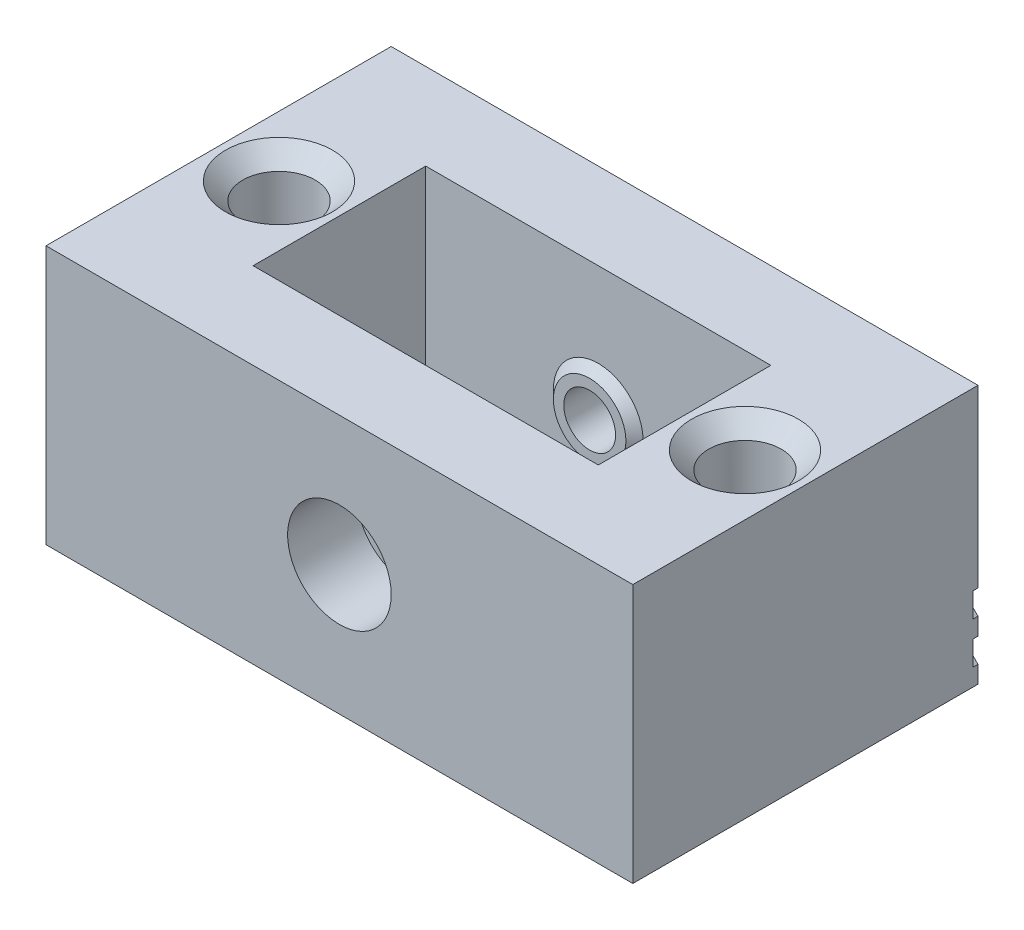
ISO-10303-21;
HEADER;
FILE_DESCRIPTION(('STEP AP214'),'2;1');
FILE_NAME('part.step','',(''),(''),'','','');
FILE_SCHEMA(('AUTOMOTIVE_DESIGN { 1 0 10303 214 1 1 1 1 }'));
ENDSEC;
DATA;
#1=APPLICATION_CONTEXT('core data for automotive mechanical design processes');
#2=APPLICATION_PROTOCOL_DEFINITION('international standard','automotive_design',2000,#1);
#3=PRODUCT_CONTEXT('',#1,'mechanical');
#4=PRODUCT('Part','Part','',(#3));
#5=PRODUCT_RELATED_PRODUCT_CATEGORY('part','',(#4));
#6=PRODUCT_DEFINITION_FORMATION('','',#4);
#7=PRODUCT_DEFINITION_CONTEXT('part definition',#1,'design');
#8=PRODUCT_DEFINITION('design','',#6,#7);
#9=PRODUCT_DEFINITION_SHAPE('','',#8);
#10=(LENGTH_UNIT() NAMED_UNIT(*) SI_UNIT(.MILLI.,.METRE.));
#11=(NAMED_UNIT(*) PLANE_ANGLE_UNIT() SI_UNIT($,.RADIAN.));
#12=(NAMED_UNIT(*) SI_UNIT($,.STERADIAN.) SOLID_ANGLE_UNIT());
#13=UNCERTAINTY_MEASURE_WITH_UNIT(LENGTH_MEASURE(1.E-05),#10,'distance_accuracy_value','');
#14=(GEOMETRIC_REPRESENTATION_CONTEXT(3) GLOBAL_UNCERTAINTY_ASSIGNED_CONTEXT((#13)) GLOBAL_UNIT_ASSIGNED_CONTEXT((#10,
#11,#12)) REPRESENTATION_CONTEXT('',''));
#15=CARTESIAN_POINT('',(0.,0.,0.));
#16=DIRECTION('',(0.,0.,1.));
#17=DIRECTION('',(1.,0.,0.));
#18=AXIS2_PLACEMENT_3D('',#15,#16,#17);
#19=CARTESIAN_POINT('',(-10.,-5.,5.));
#20=DIRECTION('',(0.,0.,1.));
#21=DIRECTION('',(1.,0.,0.));
#22=AXIS2_PLACEMENT_3D('',#19,#20,#21);
#23=PLANE('',#22);
#24=CARTESIAN_POINT('',(0.,7.5,5.));
#25=DIRECTION('',(0.,0.,1.));
#26=DIRECTION('',(1.,0.,0.));
#27=AXIS2_PLACEMENT_3D('',#24,#25,#26);
#28=CIRCLE('',#27,2.6);
#29=CARTESIAN_POINT('',(2.6,7.5,5.));
#30=VERTEX_POINT('',#29);
#31=EDGE_CURVE('E355',#30,#30,#28,.T.);
#32=ORIENTED_EDGE('',*,*,#31,.T.);
#33=EDGE_LOOP('',(#32));
#34=FACE_BOUND('',#33,.T.);
#35=DIRECTION('',(-1.,0.,0.));
#36=VECTOR('',#35,1.);
#37=CARTESIAN_POINT('',(0.,0.,5.));
#38=LINE('',#37,#36);
#39=CARTESIAN_POINT('',(10.,0.,5.));
#40=VERTEX_POINT('',#39);
#41=CARTESIAN_POINT('',(-10.,0.,5.));
#42=VERTEX_POINT('',#41);
#43=EDGE_CURVE('E345',#40,#42,#38,.T.);
#44=ORIENTED_EDGE('',*,*,#43,.T.);
#45=DIRECTION('',(0.,1.,0.));
#46=VECTOR('',#45,1.);
#47=CARTESIAN_POINT('',(-10.,-5.,5.));
#48=LINE('',#47,#46);
#49=CARTESIAN_POINT('',(-10.,15.,5.));
#50=VERTEX_POINT('',#49);
#51=EDGE_CURVE('E304',#42,#50,#48,.T.);
#52=ORIENTED_EDGE('',*,*,#51,.T.);
#53=DIRECTION('',(1.,0.,0.));
#54=VECTOR('',#53,1.);
#55=CARTESIAN_POINT('',(-10.,15.,5.));
#56=LINE('',#55,#54);
#57=CARTESIAN_POINT('',(10.,15.,5.));
#58=VERTEX_POINT('',#57);
#59=EDGE_CURVE('E295',#50,#58,#56,.T.);
#60=ORIENTED_EDGE('',*,*,#59,.T.);
#61=DIRECTION('',(0.,1.,0.));
#62=VECTOR('',#61,1.);
#63=CARTESIAN_POINT('',(10.,-5.,5.));
#64=LINE('',#63,#62);
#65=EDGE_CURVE('E310',#40,#58,#64,.T.);
#66=ORIENTED_EDGE('',*,*,#65,.F.);
#67=EDGE_LOOP('',(#44,#52,#60,#66));
#68=FACE_BOUND('',#67,.T.);
#69=ADVANCED_FACE('F37',(#34,#68),#23,.F.);
#70=CARTESIAN_POINT('',(-10.,-5.,-5.));
#71=DIRECTION('',(0.,0.,-1.));
#72=DIRECTION('',(-1.,0.,0.));
#73=AXIS2_PLACEMENT_3D('',#70,#71,#72);
#74=PLANE('',#73);
#75=CARTESIAN_POINT('',(0.,7.5,-5.));
#76=DIRECTION('',(0.,0.,-1.));
#77=DIRECTION('',(-1.,0.,0.));
#78=AXIS2_PLACEMENT_3D('',#75,#76,#77);
#79=CIRCLE('',#78,2.60000000000001);
#80=CARTESIAN_POINT('',(-2.60000000000001,7.5,-5.));
#81=VERTEX_POINT('',#80);
#82=EDGE_CURVE('E360',#81,#81,#79,.T.);
#83=ORIENTED_EDGE('',*,*,#82,.T.);
#84=EDGE_LOOP('',(#83));
#85=FACE_BOUND('',#84,.T.);
#86=DIRECTION('',(1.,0.,0.));
#87=VECTOR('',#86,1.);
#88=CARTESIAN_POINT('',(0.,0.,-5.));
#89=LINE('',#88,#87);
#90=CARTESIAN_POINT('',(-10.,0.,-5.));
#91=VERTEX_POINT('',#90);
#92=CARTESIAN_POINT('',(10.,0.,-5.));
#93=VERTEX_POINT('',#92);
#94=EDGE_CURVE('E351',#91,#93,#89,.T.);
#95=ORIENTED_EDGE('',*,*,#94,.T.);
#96=DIRECTION('',(0.,1.,0.));
#97=VECTOR('',#96,1.);
#98=CARTESIAN_POINT('',(10.,-5.,-5.));
#99=LINE('',#98,#97);
#100=CARTESIAN_POINT('',(10.,15.,-5.));
#101=VERTEX_POINT('',#100);
#102=EDGE_CURVE('E308',#93,#101,#99,.T.);
#103=ORIENTED_EDGE('',*,*,#102,.T.);
#104=DIRECTION('',(-1.,0.,0.));
#105=VECTOR('',#104,1.);
#106=CARTESIAN_POINT('',(-10.,15.,-5.));
#107=LINE('',#106,#105);
#108=CARTESIAN_POINT('',(-10.,15.,-5.));
#109=VERTEX_POINT('',#108);
#110=EDGE_CURVE('E301',#101,#109,#107,.T.);
#111=ORIENTED_EDGE('',*,*,#110,.T.);
#112=DIRECTION('',(0.,1.,0.));
#113=VECTOR('',#112,1.);
#114=CARTESIAN_POINT('',(-10.,-5.,-5.));
#115=LINE('',#114,#113);
#116=EDGE_CURVE('E305',#91,#109,#115,.T.);
#117=ORIENTED_EDGE('',*,*,#116,.F.);
#118=EDGE_LOOP('',(#95,#103,#111,#117));
#119=FACE_BOUND('',#118,.T.);
#120=ADVANCED_FACE('F441',(#85,#119),#74,.F.);
#121=CARTESIAN_POINT('',(0.,7.5,10.));
#122=DIRECTION('',(0.,0.,-1.));
#123=DIRECTION('',(-1.,0.,0.));
#124=AXIS2_PLACEMENT_3D('',#121,#122,#123);
#125=CYLINDRICAL_SURFACE('',#124,1.5);
#126=CARTESIAN_POINT('',(0.,7.5,6.));
#127=DIRECTION('',(0.,0.,1.));
#128=DIRECTION('',(1.,0.,0.));
#129=AXIS2_PLACEMENT_3D('',#126,#127,#128);
#130=CIRCLE('',#129,1.5);
#131=CARTESIAN_POINT('',(1.5,7.5,6.));
#132=VERTEX_POINT('',#131);
#133=EDGE_CURVE('E287',#132,#132,#130,.F.);
#134=ORIENTED_EDGE('',*,*,#133,.F.);
#135=EDGE_LOOP('',(#134));
#136=FACE_BOUND('',#135,.T.);
#137=CARTESIAN_POINT('',(0.,7.5,4.5));
#138=DIRECTION('',(0.,0.,-1.));
#139=DIRECTION('',(-1.,0.,0.));
#140=AXIS2_PLACEMENT_3D('',#137,#138,#139);
#141=CIRCLE('',#140,1.5);
#142=CARTESIAN_POINT('',(-1.5,7.5,4.5));
#143=VERTEX_POINT('',#142);
#144=EDGE_CURVE('E269',#143,#143,#141,.T.);
#145=ORIENTED_EDGE('',*,*,#144,.T.);
#146=EDGE_LOOP('',(#145));
#147=FACE_BOUND('',#146,.T.);
#148=ADVANCED_FACE('F447',(#136,#147),#125,.F.);
#149=CARTESIAN_POINT('',(17.,15.,10.));
#150=DIRECTION('',(-1.,0.,0.));
#151=DIRECTION('',(0.,0.,1.));
#152=AXIS2_PLACEMENT_3D('',#149,#150,#151);
#153=PLANE('',#152);
#154=DIRECTION('',(0.,-1.,0.));
#155=VECTOR('',#154,1.);
#156=CARTESIAN_POINT('',(17.,3.41421356237307,-9.7));
#157=LINE('',#156,#155);
#158=CARTESIAN_POINT('',(17.,4.82842712474617,-9.7));
#159=VERTEX_POINT('',#158);
#160=CARTESIAN_POINT('',(17.,3.41421356237307,-9.7));
#161=VERTEX_POINT('',#160);
#162=EDGE_CURVE('E230',#159,#161,#157,.T.);
#163=ORIENTED_EDGE('',*,*,#162,.F.);
#164=DIRECTION('',(0.,0.,-1.));
#165=VECTOR('',#164,1.);
#166=CARTESIAN_POINT('',(17.,4.82842712474617,-9.7));
#167=LINE('',#166,#165);
#168=CARTESIAN_POINT('',(17.,4.82842712474617,-10.));
#169=VERTEX_POINT('',#168);
#170=EDGE_CURVE('E221',#159,#169,#167,.T.);
#171=ORIENTED_EDGE('',*,*,#170,.T.);
#172=DIRECTION('',(0.,-1.,0.));
#173=VECTOR('',#172,1.);
#174=CARTESIAN_POINT('',(17.,15.,-10.));
#175=LINE('',#174,#173);
#176=CARTESIAN_POINT('',(17.,15.,-10.));
#177=VERTEX_POINT('',#176);
#178=EDGE_CURVE('E342',#177,#169,#175,.T.);
#179=ORIENTED_EDGE('',*,*,#178,.F.);
#180=DIRECTION('',(0.,0.,-1.));
#181=VECTOR('',#180,1.);
#182=CARTESIAN_POINT('',(17.,15.,10.));
#183=LINE('',#182,#181);
#184=CARTESIAN_POINT('',(17.,15.,10.));
#185=VERTEX_POINT('',#184);
#186=EDGE_CURVE('E314',#185,#177,#183,.T.);
#187=ORIENTED_EDGE('',*,*,#186,.F.);
#188=DIRECTION('',(0.,-1.,0.));
#189=VECTOR('',#188,1.);
#190=CARTESIAN_POINT('',(17.,15.,10.));
#191=LINE('',#190,#189);
#192=CARTESIAN_POINT('',(17.,0.,10.));
#193=VERTEX_POINT('',#192);
#194=EDGE_CURVE('E324',#185,#193,#191,.T.);
#195=ORIENTED_EDGE('',*,*,#194,.T.);
#196=DIRECTION('',(0.,0.,-1.));
#197=VECTOR('',#196,1.);
#198=CARTESIAN_POINT('',(17.,0.,10.));
#199=LINE('',#198,#197);
#200=CARTESIAN_POINT('',(17.,0.,-10.));
#201=VERTEX_POINT('',#200);
#202=EDGE_CURVE('E307',#193,#201,#199,.T.);
#203=ORIENTED_EDGE('',*,*,#202,.T.);
#204=CARTESIAN_POINT('',(17.,0.999999999999997,-10.));
#205=VERTEX_POINT('',#204);
#206=EDGE_CURVE('E340',#205,#201,#175,.T.);
#207=ORIENTED_EDGE('',*,*,#206,.F.);
#208=DIRECTION('',(0.,0.,-1.));
#209=VECTOR('',#208,1.);
#210=CARTESIAN_POINT('',(17.,1.,-9.7));
#211=LINE('',#210,#209);
#212=CARTESIAN_POINT('',(17.,1.,-9.7));
#213=VERTEX_POINT('',#212);
#214=EDGE_CURVE('E53',#213,#205,#211,.T.);
#215=ORIENTED_EDGE('',*,*,#214,.F.);
#216=DIRECTION('',(0.,-1.,0.));
#217=VECTOR('',#216,1.);
#218=CARTESIAN_POINT('',(17.,1.,-9.7));
#219=LINE('',#218,#217);
#220=CARTESIAN_POINT('',(17.,2.41421356237307,-9.7));
#221=VERTEX_POINT('',#220);
#222=EDGE_CURVE('E247',#221,#213,#219,.T.);
#223=ORIENTED_EDGE('',*,*,#222,.F.);
#224=DIRECTION('',(0.,0.,-1.));
#225=VECTOR('',#224,1.);
#226=CARTESIAN_POINT('',(17.,2.41421356237307,-9.7));
#227=LINE('',#226,#225);
#228=CARTESIAN_POINT('',(17.,2.41421356237307,-10.));
#229=VERTEX_POINT('',#228);
#230=EDGE_CURVE('E259',#221,#229,#227,.T.);
#231=ORIENTED_EDGE('',*,*,#230,.T.);
#232=CARTESIAN_POINT('',(17.,3.41421356237307,-10.));
#233=VERTEX_POINT('',#232);
#234=EDGE_CURVE('E346',#233,#229,#175,.T.);
#235=ORIENTED_EDGE('',*,*,#234,.F.);
#236=DIRECTION('',(0.,0.,-1.));
#237=VECTOR('',#236,1.);
#238=CARTESIAN_POINT('',(17.,3.41421356237307,-9.7));
#239=LINE('',#238,#237);
#240=EDGE_CURVE('E61',#161,#233,#239,.T.);
#241=ORIENTED_EDGE('',*,*,#240,.F.);
#242=EDGE_LOOP('',(#163,#171,#179,#187,#195,#203,#207,#215,#223,#231,#235,#241));
#243=FACE_BOUND('',#242,.T.);
#244=ADVANCED_FACE('F404',(#243),#153,.F.);
#245=CARTESIAN_POINT('',(-17.,15.,-10.));
#246=DIRECTION('',(0.,0.,1.));
#247=DIRECTION('',(1.,0.,0.));
#248=AXIS2_PLACEMENT_3D('',#245,#246,#247);
#249=PLANE('',#248);
#250=CARTESIAN_POINT('',(0.,7.5,-10.));
#251=DIRECTION('',(0.,0.,-1.));
#252=DIRECTION('',(-1.,0.,0.));
#253=AXIS2_PLACEMENT_3D('',#250,#251,#252);
#254=CIRCLE('',#253,1.5);
#255=CARTESIAN_POINT('',(-1.5,7.5,-10.));
#256=VERTEX_POINT('',#255);
#257=EDGE_CURVE('E290',#256,#256,#254,.T.);
#258=ORIENTED_EDGE('',*,*,#257,.F.);
#259=EDGE_LOOP('',(#258));
#260=FACE_BOUND('',#259,.T.);
#261=DIRECTION('',(-0.707106781186538,-0.707106781186557,0.));
#262=VECTOR('',#261,1.);
#263=CARTESIAN_POINT('',(-16.2928932188135,1.70710678118656,-10.));
#264=LINE('',#263,#262);
#265=CARTESIAN_POINT('',(-16.2928932188135,1.70710678118656,-10.));
#266=VERTEX_POINT('',#265);
#267=CARTESIAN_POINT('',(-17.,1.,-10.));
#268=VERTEX_POINT('',#267);
#269=EDGE_CURVE('E212',#266,#268,#264,.T.);
#270=ORIENTED_EDGE('',*,*,#269,.F.);
#271=DIRECTION('',(0.707106781186556,-0.707106781186539,0.));
#272=VECTOR('',#271,1.);
#273=CARTESIAN_POINT('',(-17.,2.41421356237308,-10.));
#274=LINE('',#273,#272);
#275=CARTESIAN_POINT('',(-17.,2.41421356237308,-10.));
#276=VERTEX_POINT('',#275);
#277=EDGE_CURVE('E218',#276,#266,#274,.T.);
#278=ORIENTED_EDGE('',*,*,#277,.F.);
#279=DIRECTION('',(0.,-1.,0.));
#280=VECTOR('',#279,1.);
#281=CARTESIAN_POINT('',(-17.,15.,-10.));
#282=LINE('',#281,#280);
#283=CARTESIAN_POINT('',(-17.,3.41421356237307,-10.));
#284=VERTEX_POINT('',#283);
#285=EDGE_CURVE('E341',#284,#276,#282,.T.);
#286=ORIENTED_EDGE('',*,*,#285,.F.);
#287=DIRECTION('',(-0.707106781186542,-0.707106781186553,0.));
#288=VECTOR('',#287,1.);
#289=CARTESIAN_POINT('',(-16.2928932188135,4.12132034355963,-10.));
#290=LINE('',#289,#288);
#291=CARTESIAN_POINT('',(-16.2928932188135,4.12132034355963,-10.));
#292=VERTEX_POINT('',#291);
#293=EDGE_CURVE('E733',#292,#284,#290,.T.);
#294=ORIENTED_EDGE('',*,*,#293,.F.);
#295=DIRECTION('',(0.707106781186552,-0.707106781186543,0.));
#296=VECTOR('',#295,1.);
#297=CARTESIAN_POINT('',(-17.,4.82842712474617,-10.));
#298=LINE('',#297,#296);
#299=CARTESIAN_POINT('',(-17.,4.82842712474617,-10.));
#300=VERTEX_POINT('',#299);
#301=EDGE_CURVE('E731',#300,#292,#298,.T.);
#302=ORIENTED_EDGE('',*,*,#301,.F.);
#303=CARTESIAN_POINT('',(-17.,15.,-10.));
#304=VERTEX_POINT('',#303);
#305=EDGE_CURVE('E201',#304,#300,#282,.T.);
#306=ORIENTED_EDGE('',*,*,#305,.F.);
#307=DIRECTION('',(-1.,0.,0.));
#308=VECTOR('',#307,1.);
#309=CARTESIAN_POINT('',(-17.,15.,-10.));
#310=LINE('',#309,#308);
#311=EDGE_CURVE('E317',#177,#304,#310,.T.);
#312=ORIENTED_EDGE('',*,*,#311,.F.);
#313=ORIENTED_EDGE('',*,*,#178,.T.);
#314=DIRECTION('',(0.707106781186552,0.707106781186543,0.));
#315=VECTOR('',#314,1.);
#316=CARTESIAN_POINT('',(17.,4.82842712474617,-10.));
#317=LINE('',#316,#315);
#318=CARTESIAN_POINT('',(16.2928932188135,4.12132034355963,-10.));
#319=VERTEX_POINT('',#318);
#320=EDGE_CURVE('E234',#319,#169,#317,.T.);
#321=ORIENTED_EDGE('',*,*,#320,.F.);
#322=DIRECTION('',(-0.707106781186535,0.70710678118656,0.));
#323=VECTOR('',#322,1.);
#324=CARTESIAN_POINT('',(16.2928932188135,4.12132034355963,-10.));
#325=LINE('',#324,#323);
#326=EDGE_CURVE('E203',#233,#319,#325,.T.);
#327=ORIENTED_EDGE('',*,*,#326,.F.);
#328=ORIENTED_EDGE('',*,*,#234,.T.);
#329=DIRECTION('',(0.707106781186559,0.707106781186536,0.));
#330=VECTOR('',#329,1.);
#331=CARTESIAN_POINT('',(17.,2.41421356237307,-10.));
#332=LINE('',#331,#330);
#333=CARTESIAN_POINT('',(16.2928932188132,1.70710678118633,-10.));
#334=VERTEX_POINT('',#333);
#335=EDGE_CURVE('E251',#334,#229,#332,.T.);
#336=ORIENTED_EDGE('',*,*,#335,.F.);
#337=DIRECTION('',(-0.707106781186763,0.707106781186332,0.));
#338=VECTOR('',#337,1.);
#339=CARTESIAN_POINT('',(16.2928932188132,1.70710678118633,-10.));
#340=LINE('',#339,#338);
#341=EDGE_CURVE('E225',#205,#334,#340,.T.);
#342=ORIENTED_EDGE('',*,*,#341,.F.);
#343=ORIENTED_EDGE('',*,*,#206,.T.);
#344=DIRECTION('',(-1.,0.,0.));
#345=VECTOR('',#344,1.);
#346=CARTESIAN_POINT('',(-17.,0.,-10.));
#347=LINE('',#346,#345);
#348=CARTESIAN_POINT('',(-17.,0.,-10.));
#349=VERTEX_POINT('',#348);
#350=EDGE_CURVE('E327',#201,#349,#347,.T.);
#351=ORIENTED_EDGE('',*,*,#350,.T.);
#352=EDGE_CURVE('E338',#268,#349,#282,.T.);
#353=ORIENTED_EDGE('',*,*,#352,.F.);
#354=EDGE_LOOP('',(#270,#278,#286,#294,#302,#306,#312,#313,#321,#327,#328,#336,#342,#343,#351,#353));
#355=FACE_BOUND('',#354,.T.);
#356=ADVANCED_FACE('F417',(#260,#355),#249,.F.);
#357=CARTESIAN_POINT('',(-17.,15.,10.));
#358=DIRECTION('',(1.,0.,0.));
#359=DIRECTION('',(0.,0.,-1.));
#360=AXIS2_PLACEMENT_3D('',#357,#358,#359);
#361=PLANE('',#360);
#362=ORIENTED_EDGE('',*,*,#285,.T.);
#363=DIRECTION('',(0.,0.,-1.));
#364=VECTOR('',#363,1.);
#365=CARTESIAN_POINT('',(-17.,2.41421356237308,-9.7));
#366=LINE('',#365,#364);
#367=CARTESIAN_POINT('',(-17.,2.41421356237308,-9.7));
#368=VERTEX_POINT('',#367);
#369=EDGE_CURVE('E223',#368,#276,#366,.T.);
#370=ORIENTED_EDGE('',*,*,#369,.F.);
#371=DIRECTION('',(0.,1.,0.));
#372=VECTOR('',#371,1.);
#373=CARTESIAN_POINT('',(-17.,1.,-9.7));
#374=LINE('',#373,#372);
#375=CARTESIAN_POINT('',(-17.,0.999999999999999,-9.7));
#376=VERTEX_POINT('',#375);
#377=EDGE_CURVE('E214',#376,#368,#374,.T.);
#378=ORIENTED_EDGE('',*,*,#377,.F.);
#379=DIRECTION('',(0.,0.,-1.));
#380=VECTOR('',#379,1.);
#381=CARTESIAN_POINT('',(-17.,1.,-9.7));
#382=LINE('',#381,#380);
#383=EDGE_CURVE('E226',#376,#268,#382,.T.);
#384=ORIENTED_EDGE('',*,*,#383,.T.);
#385=ORIENTED_EDGE('',*,*,#352,.T.);
#386=DIRECTION('',(0.,0.,1.));
#387=VECTOR('',#386,1.);
#388=CARTESIAN_POINT('',(-17.,0.,10.));
#389=LINE('',#388,#387);
#390=CARTESIAN_POINT('',(-17.,0.,10.));
#391=VERTEX_POINT('',#390);
#392=EDGE_CURVE('E330',#349,#391,#389,.T.);
#393=ORIENTED_EDGE('',*,*,#392,.T.);
#394=DIRECTION('',(0.,-1.,0.));
#395=VECTOR('',#394,1.);
#396=CARTESIAN_POINT('',(-17.,15.,10.));
#397=LINE('',#396,#395);
#398=CARTESIAN_POINT('',(-17.,15.,10.));
#399=VERTEX_POINT('',#398);
#400=EDGE_CURVE('E335',#399,#391,#397,.T.);
#401=ORIENTED_EDGE('',*,*,#400,.F.);
#402=DIRECTION('',(0.,0.,1.));
#403=VECTOR('',#402,1.);
#404=CARTESIAN_POINT('',(-17.,15.,10.));
#405=LINE('',#404,#403);
#406=EDGE_CURVE('E320',#304,#399,#405,.T.);
#407=ORIENTED_EDGE('',*,*,#406,.F.);
#408=ORIENTED_EDGE('',*,*,#305,.T.);
#409=DIRECTION('',(0.,0.,-1.));
#410=VECTOR('',#409,1.);
#411=CARTESIAN_POINT('',(-17.,4.82842712474617,-9.7));
#412=LINE('',#411,#410);
#413=CARTESIAN_POINT('',(-17.,4.82842712474617,-9.7));
#414=VERTEX_POINT('',#413);
#415=EDGE_CURVE('E191',#414,#300,#412,.T.);
#416=ORIENTED_EDGE('',*,*,#415,.F.);
#417=DIRECTION('',(0.,1.,0.));
#418=VECTOR('',#417,1.);
#419=CARTESIAN_POINT('',(-17.,3.41421356237307,-9.7));
#420=LINE('',#419,#418);
#421=CARTESIAN_POINT('',(-17.,3.41421356237307,-9.7));
#422=VERTEX_POINT('',#421);
#423=EDGE_CURVE('E177',#422,#414,#420,.T.);
#424=ORIENTED_EDGE('',*,*,#423,.F.);
#425=DIRECTION('',(0.,0.,-1.));
#426=VECTOR('',#425,1.);
#427=CARTESIAN_POINT('',(-17.,3.41421356237307,-9.7));
#428=LINE('',#427,#426);
#429=EDGE_CURVE('E194',#422,#284,#428,.T.);
#430=ORIENTED_EDGE('',*,*,#429,.T.);
#431=EDGE_LOOP('',(#362,#370,#378,#384,#385,#393,#401,#407,#408,#416,#424,#430));
#432=FACE_BOUND('',#431,.T.);
#433=ADVANCED_FACE('F198',(#432),#361,.F.);
#434=CARTESIAN_POINT('',(-17.,15.,10.));
#435=DIRECTION('',(0.,0.,-1.));
#436=DIRECTION('',(-1.,0.,0.));
#437=AXIS2_PLACEMENT_3D('',#434,#435,#436);
#438=PLANE('',#437);
#439=CARTESIAN_POINT('',(0.,7.5,10.));
#440=DIRECTION('',(0.,0.,1.));
#441=DIRECTION('',(1.,0.,0.));
#442=AXIS2_PLACEMENT_3D('',#439,#440,#441);
#443=CIRCLE('',#442,3.);
#444=CARTESIAN_POINT('',(3.,7.5,10.));
#445=VERTEX_POINT('',#444);
#446=EDGE_CURVE('E283',#445,#445,#443,.T.);
#447=ORIENTED_EDGE('',*,*,#446,.F.);
#448=EDGE_LOOP('',(#447));
#449=FACE_BOUND('',#448,.T.);
#450=DIRECTION('',(1.,0.,0.));
#451=VECTOR('',#450,1.);
#452=CARTESIAN_POINT('',(-17.,0.,10.));
#453=LINE('',#452,#451);
#454=EDGE_CURVE('E318',#391,#193,#453,.T.);
#455=ORIENTED_EDGE('',*,*,#454,.T.);
#456=ORIENTED_EDGE('',*,*,#194,.F.);
#457=DIRECTION('',(1.,0.,0.));
#458=VECTOR('',#457,1.);
#459=CARTESIAN_POINT('',(-17.,15.,10.));
#460=LINE('',#459,#458);
#461=EDGE_CURVE('E322',#399,#185,#460,.T.);
#462=ORIENTED_EDGE('',*,*,#461,.F.);
#463=ORIENTED_EDGE('',*,*,#400,.T.);
#464=EDGE_LOOP('',(#455,#456,#462,#463));
#465=FACE_BOUND('',#464,.T.);
#466=ADVANCED_FACE('F410',(#449,#465),#438,.F.);
#467=CARTESIAN_POINT('',(0.,15.,0.));
#468=DIRECTION('',(0.,-1.,0.));
#469=DIRECTION('',(0.,0.,-1.));
#470=AXIS2_PLACEMENT_3D('',#467,#468,#469);
#471=PLANE('',#470);
#472=CARTESIAN_POINT('',(13.5,15.,0.));
#473=DIRECTION('',(0.,-1.,0.));
#474=DIRECTION('',(0.,0.,-1.));
#475=AXIS2_PLACEMENT_3D('',#472,#473,#474);
#476=CIRCLE('',#475,3.10000000000001);
#477=CARTESIAN_POINT('',(13.5,15.,-3.10000000000001));
#478=VERTEX_POINT('',#477);
#479=EDGE_CURVE('E46',#478,#478,#476,.T.);
#480=ORIENTED_EDGE('',*,*,#479,.T.);
#481=EDGE_LOOP('',(#480));
#482=FACE_BOUND('',#481,.T.);
#483=CARTESIAN_POINT('',(-13.5,15.,0.));
#484=DIRECTION('',(0.,-1.,0.));
#485=DIRECTION('',(0.,0.,-1.));
#486=AXIS2_PLACEMENT_3D('',#483,#484,#485);
#487=CIRCLE('',#486,3.10000000000001);
#488=CARTESIAN_POINT('',(-13.5,15.,-3.10000000000001));
#489=VERTEX_POINT('',#488);
#490=EDGE_CURVE('E366',#489,#489,#487,.T.);
#491=ORIENTED_EDGE('',*,*,#490,.T.);
#492=EDGE_LOOP('',(#491));
#493=FACE_BOUND('',#492,.T.);
#494=ORIENTED_EDGE('',*,*,#59,.F.);
#495=DIRECTION('',(0.,0.,1.));
#496=VECTOR('',#495,1.);
#497=CARTESIAN_POINT('',(-10.,15.,5.));
#498=LINE('',#497,#496);
#499=EDGE_CURVE('E293',#109,#50,#498,.T.);
#500=ORIENTED_EDGE('',*,*,#499,.F.);
#501=ORIENTED_EDGE('',*,*,#110,.F.);
#502=DIRECTION('',(0.,0.,-1.));
#503=VECTOR('',#502,1.);
#504=CARTESIAN_POINT('',(10.,15.,5.));
#505=LINE('',#504,#503);
#506=EDGE_CURVE('E298',#58,#101,#505,.T.);
#507=ORIENTED_EDGE('',*,*,#506,.F.);
#508=EDGE_LOOP('',(#494,#500,#501,#507));
#509=FACE_BOUND('',#508,.T.);
#510=ORIENTED_EDGE('',*,*,#186,.T.);
#511=ORIENTED_EDGE('',*,*,#311,.T.);
#512=ORIENTED_EDGE('',*,*,#406,.T.);
#513=ORIENTED_EDGE('',*,*,#461,.T.);
#514=EDGE_LOOP('',(#510,#511,#512,#513));
#515=FACE_BOUND('',#514,.T.);
#516=ADVANCED_FACE('F371',(#482,#493,#509,#515),#471,.F.);
#517=CARTESIAN_POINT('',(0.,0.,0.));
#518=DIRECTION('',(0.,-1.,0.));
#519=DIRECTION('',(0.,0.,-1.));
#520=AXIS2_PLACEMENT_3D('',#517,#518,#519);
#521=PLANE('',#520);
#522=CARTESIAN_POINT('',(-13.5,0.,0.));
#523=DIRECTION('',(0.,1.,0.));
#524=DIRECTION('',(0.,0.,1.));
#525=AXIS2_PLACEMENT_3D('',#522,#523,#524);
#526=CIRCLE('',#525,2.1);
#527=CARTESIAN_POINT('',(-13.5,0.,2.1));
#528=VERTEX_POINT('',#527);
#529=EDGE_CURVE('E266',#528,#528,#526,.T.);
#530=ORIENTED_EDGE('',*,*,#529,.T.);
#531=EDGE_LOOP('',(#530));
#532=FACE_BOUND('',#531,.T.);
#533=CARTESIAN_POINT('',(13.5,0.,0.));
#534=DIRECTION('',(0.,1.,0.));
#535=DIRECTION('',(0.,0.,1.));
#536=AXIS2_PLACEMENT_3D('',#533,#534,#535);
#537=CIRCLE('',#536,2.1);
#538=CARTESIAN_POINT('',(13.5,0.,2.1));
#539=VERTEX_POINT('',#538);
#540=EDGE_CURVE('E262',#539,#539,#537,.T.);
#541=ORIENTED_EDGE('',*,*,#540,.T.);
#542=EDGE_LOOP('',(#541));
#543=FACE_BOUND('',#542,.T.);
#544=DIRECTION('',(0.,0.,-1.));
#545=VECTOR('',#544,1.);
#546=CARTESIAN_POINT('',(-10.,0.,0.));
#547=LINE('',#546,#545);
#548=EDGE_CURVE('E353',#42,#91,#547,.T.);
#549=ORIENTED_EDGE('',*,*,#548,.F.);
#550=ORIENTED_EDGE('',*,*,#43,.F.);
#551=DIRECTION('',(0.,0.,1.));
#552=VECTOR('',#551,1.);
#553=CARTESIAN_POINT('',(10.,0.,0.));
#554=LINE('',#553,#552);
#555=EDGE_CURVE('E348',#93,#40,#554,.T.);
#556=ORIENTED_EDGE('',*,*,#555,.F.);
#557=ORIENTED_EDGE('',*,*,#94,.F.);
#558=EDGE_LOOP('',(#549,#550,#556,#557));
#559=FACE_BOUND('',#558,.T.);
#560=ORIENTED_EDGE('',*,*,#202,.F.);
#561=ORIENTED_EDGE('',*,*,#454,.F.);
#562=ORIENTED_EDGE('',*,*,#392,.F.);
#563=ORIENTED_EDGE('',*,*,#350,.F.);
#564=EDGE_LOOP('',(#560,#561,#562,#563));
#565=FACE_BOUND('',#564,.T.);
#566=ADVANCED_FACE('F387',(#532,#543,#559,#565),#521,.T.);
#567=CARTESIAN_POINT('',(-10.,-5.,5.));
#568=DIRECTION('',(-1.,0.,0.));
#569=DIRECTION('',(0.,0.,1.));
#570=AXIS2_PLACEMENT_3D('',#567,#568,#569);
#571=PLANE('',#570);
#572=ORIENTED_EDGE('',*,*,#548,.T.);
#573=ORIENTED_EDGE('',*,*,#116,.T.);
#574=ORIENTED_EDGE('',*,*,#499,.T.);
#575=ORIENTED_EDGE('',*,*,#51,.F.);
#576=EDGE_LOOP('',(#572,#573,#574,#575));
#577=FACE_BOUND('',#576,.T.);
#578=ADVANCED_FACE('F390',(#577),#571,.F.);
#579=CARTESIAN_POINT('',(10.,-5.,5.));
#580=DIRECTION('',(1.,0.,0.));
#581=DIRECTION('',(0.,0.,-1.));
#582=AXIS2_PLACEMENT_3D('',#579,#580,#581);
#583=PLANE('',#582);
#584=ORIENTED_EDGE('',*,*,#555,.T.);
#585=ORIENTED_EDGE('',*,*,#65,.T.);
#586=ORIENTED_EDGE('',*,*,#506,.T.);
#587=ORIENTED_EDGE('',*,*,#102,.F.);
#588=EDGE_LOOP('',(#584,#585,#586,#587));
#589=FACE_BOUND('',#588,.T.);
#590=ADVANCED_FACE('F453',(#589),#583,.F.);
#591=ORIENTED_EDGE('',*,*,#257,.T.);
#592=EDGE_LOOP('',(#591));
#593=FACE_BOUND('',#592,.T.);
#594=CARTESIAN_POINT('',(0.,7.5,-4.5));
#595=DIRECTION('',(0.,0.,1.));
#596=DIRECTION('',(1.,0.,0.));
#597=AXIS2_PLACEMENT_3D('',#594,#595,#596);
#598=CIRCLE('',#597,1.5);
#599=CARTESIAN_POINT('',(1.5,7.5,-4.5));
#600=VERTEX_POINT('',#599);
#601=EDGE_CURVE('E277',#600,#600,#598,.T.);
#602=ORIENTED_EDGE('',*,*,#601,.T.);
#603=EDGE_LOOP('',(#602));
#604=FACE_BOUND('',#603,.T.);
#605=ADVANCED_FACE('F500',(#593,#604),#125,.F.);
#606=CARTESIAN_POINT('',(0.,7.5,6.));
#607=DIRECTION('',(0.,0.,1.));
#608=DIRECTION('',(1.,0.,0.));
#609=AXIS2_PLACEMENT_3D('',#606,#607,#608);
#610=PLANE('',#609);
#611=CARTESIAN_POINT('',(0.,7.5,6.));
#612=DIRECTION('',(0.,0.,1.));
#613=DIRECTION('',(1.,0.,0.));
#614=AXIS2_PLACEMENT_3D('',#611,#612,#613);
#615=CIRCLE('',#614,3.);
#616=CARTESIAN_POINT('',(3.,7.5,6.));
#617=VERTEX_POINT('',#616);
#618=EDGE_CURVE('E284',#617,#617,#615,.T.);
#619=ORIENTED_EDGE('',*,*,#618,.T.);
#620=EDGE_LOOP('',(#619));
#621=FACE_BOUND('',#620,.T.);
#622=ORIENTED_EDGE('',*,*,#133,.T.);
#623=EDGE_LOOP('',(#622));
#624=FACE_BOUND('',#623,.T.);
#625=ADVANCED_FACE('F502',(#621,#624),#610,.T.);
#626=CARTESIAN_POINT('',(0.,7.5,6.));
#627=DIRECTION('',(0.,0.,1.));
#628=DIRECTION('',(1.,0.,0.));
#629=AXIS2_PLACEMENT_3D('',#626,#627,#628);
#630=CYLINDRICAL_SURFACE('',#629,3.);
#631=ORIENTED_EDGE('',*,*,#618,.F.);
#632=EDGE_LOOP('',(#631));
#633=FACE_BOUND('',#632,.T.);
#634=ORIENTED_EDGE('',*,*,#446,.T.);
#635=EDGE_LOOP('',(#634));
#636=FACE_BOUND('',#635,.T.);
#637=ADVANCED_FACE('F496',(#633,#636),#630,.F.);
#638=CARTESIAN_POINT('',(0.,7.5,-4.5));
#639=DIRECTION('',(0.,0.,1.));
#640=DIRECTION('',(1.,0.,0.));
#641=AXIS2_PLACEMENT_3D('',#638,#639,#640);
#642=PLANE('',#641);
#643=CARTESIAN_POINT('',(0.,7.5,-4.5));
#644=DIRECTION('',(0.,0.,1.));
#645=DIRECTION('',(1.,0.,0.));
#646=AXIS2_PLACEMENT_3D('',#643,#644,#645);
#647=CIRCLE('',#646,2.1);
#648=CARTESIAN_POINT('',(2.1,7.5,-4.5));
#649=VERTEX_POINT('',#648);
#650=EDGE_CURVE('E280',#649,#649,#647,.T.);
#651=ORIENTED_EDGE('',*,*,#650,.T.);
#652=EDGE_LOOP('',(#651));
#653=FACE_BOUND('',#652,.T.);
#654=ORIENTED_EDGE('',*,*,#601,.F.);
#655=EDGE_LOOP('',(#654));
#656=FACE_BOUND('',#655,.T.);
#657=ADVANCED_FACE('F493',(#653,#656),#642,.T.);
#658=CARTESIAN_POINT('',(0.,7.5,4.5));
#659=DIRECTION('',(0.,0.,-1.));
#660=DIRECTION('',(-1.,0.,0.));
#661=AXIS2_PLACEMENT_3D('',#658,#659,#660);
#662=PLANE('',#661);
#663=CARTESIAN_POINT('',(0.,7.5,4.5));
#664=DIRECTION('',(0.,0.,-1.));
#665=DIRECTION('',(-1.,0.,0.));
#666=AXIS2_PLACEMENT_3D('',#663,#664,#665);
#667=CIRCLE('',#666,2.1);
#668=CARTESIAN_POINT('',(-2.1,7.5,4.5));
#669=VERTEX_POINT('',#668);
#670=EDGE_CURVE('E274',#669,#669,#667,.T.);
#671=ORIENTED_EDGE('',*,*,#670,.T.);
#672=EDGE_LOOP('',(#671));
#673=FACE_BOUND('',#672,.T.);
#674=ORIENTED_EDGE('',*,*,#144,.F.);
#675=EDGE_LOOP('',(#674));
#676=FACE_BOUND('',#675,.T.);
#677=ADVANCED_FACE('F476',(#673,#676),#662,.T.);
#678=CARTESIAN_POINT('',(0.,7.5,4.49999999999999));
#679=DIRECTION('',(0.,0.,1.));
#680=DIRECTION('',(1.,0.,0.));
#681=AXIS2_PLACEMENT_3D('',#678,#679,#680);
#682=CONICAL_SURFACE('',#681,2.1,0.785398163397439);
#683=ORIENTED_EDGE('',*,*,#31,.F.);
#684=EDGE_LOOP('',(#683));
#685=FACE_BOUND('',#684,.T.);
#686=ORIENTED_EDGE('',*,*,#670,.F.);
#687=EDGE_LOOP('',(#686));
#688=FACE_BOUND('',#687,.T.);
#689=ADVANCED_FACE('F470',(#685,#688),#682,.T.);
#690=CARTESIAN_POINT('',(0.,7.5,-4.49999999999999));
#691=DIRECTION('',(0.,0.,-1.));
#692=DIRECTION('',(-1.,0.,0.));
#693=AXIS2_PLACEMENT_3D('',#690,#691,#692);
#694=CONICAL_SURFACE('',#693,2.1,0.785398163397446);
#695=ORIENTED_EDGE('',*,*,#82,.F.);
#696=EDGE_LOOP('',(#695));
#697=FACE_BOUND('',#696,.T.);
#698=ORIENTED_EDGE('',*,*,#650,.F.);
#699=EDGE_LOOP('',(#698));
#700=FACE_BOUND('',#699,.T.);
#701=ADVANCED_FACE('F383',(#697,#700),#694,.T.);
#702=CARTESIAN_POINT('',(13.5,0.,0.));
#703=DIRECTION('',(0.,1.,0.));
#704=DIRECTION('',(0.,0.,1.));
#705=AXIS2_PLACEMENT_3D('',#702,#703,#704);
#706=CYLINDRICAL_SURFACE('',#705,2.1);
#707=CARTESIAN_POINT('',(13.5,14.,0.));
#708=DIRECTION('',(0.,-1.,0.));
#709=DIRECTION('',(0.,0.,-1.));
#710=AXIS2_PLACEMENT_3D('',#707,#708,#709);
#711=CIRCLE('',#710,2.1);
#712=CARTESIAN_POINT('',(13.5,14.,-2.1));
#713=VERTEX_POINT('',#712);
#714=EDGE_CURVE('E363',#713,#713,#711,.F.);
#715=ORIENTED_EDGE('',*,*,#714,.T.);
#716=EDGE_LOOP('',(#715));
#717=FACE_BOUND('',#716,.T.);
#718=ORIENTED_EDGE('',*,*,#540,.F.);
#719=EDGE_LOOP('',(#718));
#720=FACE_BOUND('',#719,.T.);
#721=ADVANCED_FACE('F380',(#717,#720),#706,.F.);
#722=CARTESIAN_POINT('',(-13.5,0.,0.));
#723=DIRECTION('',(0.,1.,0.));
#724=DIRECTION('',(0.,0.,1.));
#725=AXIS2_PLACEMENT_3D('',#722,#723,#724);
#726=CYLINDRICAL_SURFACE('',#725,2.1);
#727=CARTESIAN_POINT('',(-13.5,14.,0.));
#728=DIRECTION('',(0.,-1.,0.));
#729=DIRECTION('',(0.,0.,-1.));
#730=AXIS2_PLACEMENT_3D('',#727,#728,#729);
#731=CIRCLE('',#730,2.1);
#732=CARTESIAN_POINT('',(-13.5,14.,-2.1));
#733=VERTEX_POINT('',#732);
#734=EDGE_CURVE('E11',#733,#733,#731,.F.);
#735=ORIENTED_EDGE('',*,*,#734,.T.);
#736=EDGE_LOOP('',(#735));
#737=FACE_BOUND('',#736,.T.);
#738=ORIENTED_EDGE('',*,*,#529,.F.);
#739=EDGE_LOOP('',(#738));
#740=FACE_BOUND('',#739,.T.);
#741=ADVANCED_FACE('F377',(#737,#740),#726,.F.);
#742=CARTESIAN_POINT('',(13.5,14.,0.));
#743=DIRECTION('',(0.,1.,0.));
#744=DIRECTION('',(0.,0.,1.));
#745=AXIS2_PLACEMENT_3D('',#742,#743,#744);
#746=CONICAL_SURFACE('',#745,2.1,0.785398163397448);
#747=ORIENTED_EDGE('',*,*,#479,.F.);
#748=EDGE_LOOP('',(#747));
#749=FACE_BOUND('',#748,.T.);
#750=ORIENTED_EDGE('',*,*,#714,.F.);
#751=EDGE_LOOP('',(#750));
#752=FACE_BOUND('',#751,.T.);
#753=ADVANCED_FACE('F374',(#749,#752),#746,.F.);
#754=CARTESIAN_POINT('',(-13.5,14.,0.));
#755=DIRECTION('',(0.,1.,0.));
#756=DIRECTION('',(0.,0.,1.));
#757=AXIS2_PLACEMENT_3D('',#754,#755,#756);
#758=CONICAL_SURFACE('',#757,2.1,0.785398163397449);
#759=ORIENTED_EDGE('',*,*,#490,.F.);
#760=EDGE_LOOP('',(#759));
#761=FACE_BOUND('',#760,.T.);
#762=ORIENTED_EDGE('',*,*,#734,.F.);
#763=EDGE_LOOP('',(#762));
#764=FACE_BOUND('',#763,.T.);
#765=ADVANCED_FACE('F40',(#761,#764),#758,.F.);
#766=CARTESIAN_POINT('',(-16.2928932188135,4.12132034355963,-9.7));
#767=DIRECTION('',(0.707106781186553,-0.707106781186542,0.));
#768=DIRECTION('',(0.707106781186542,0.707106781186553,0.));
#769=AXIS2_PLACEMENT_3D('',#766,#767,#768);
#770=PLANE('',#769);
#771=ORIENTED_EDGE('',*,*,#293,.T.);
#772=ORIENTED_EDGE('',*,*,#429,.F.);
#773=DIRECTION('',(-0.707106781186542,-0.707106781186553,0.));
#774=VECTOR('',#773,1.);
#775=CARTESIAN_POINT('',(-16.2928932188135,4.12132034355963,-9.7));
#776=LINE('',#775,#774);
#777=CARTESIAN_POINT('',(-16.2928932188135,4.12132034355963,-9.7));
#778=VERTEX_POINT('',#777);
#779=EDGE_CURVE('E182',#778,#422,#776,.T.);
#780=ORIENTED_EDGE('',*,*,#779,.F.);
#781=DIRECTION('',(0.,0.,-1.));
#782=VECTOR('',#781,1.);
#783=CARTESIAN_POINT('',(-16.2928932188135,4.12132034355963,-9.7));
#784=LINE('',#783,#782);
#785=EDGE_CURVE('E193',#778,#292,#784,.T.);
#786=ORIENTED_EDGE('',*,*,#785,.T.);
#787=EDGE_LOOP('',(#771,#772,#780,#786));
#788=FACE_BOUND('',#787,.T.);
#789=ADVANCED_FACE('F614',(#788),#770,.F.);
#790=CARTESIAN_POINT('',(-17.,4.82842712474617,-9.7));
#791=DIRECTION('',(0.707106781186543,0.707106781186552,0.));
#792=DIRECTION('',(-0.707106781186552,0.707106781186543,0.));
#793=AXIS2_PLACEMENT_3D('',#790,#791,#792);
#794=PLANE('',#793);
#795=ORIENTED_EDGE('',*,*,#301,.T.);
#796=ORIENTED_EDGE('',*,*,#785,.F.);
#797=DIRECTION('',(0.707106781186552,-0.707106781186543,0.));
#798=VECTOR('',#797,1.);
#799=CARTESIAN_POINT('',(-17.,4.82842712474617,-9.7));
#800=LINE('',#799,#798);
#801=EDGE_CURVE('E180',#414,#778,#800,.T.);
#802=ORIENTED_EDGE('',*,*,#801,.F.);
#803=ORIENTED_EDGE('',*,*,#415,.T.);
#804=EDGE_LOOP('',(#795,#796,#802,#803));
#805=FACE_BOUND('',#804,.T.);
#806=ADVANCED_FACE('F190',(#805),#794,.F.);
#807=CARTESIAN_POINT('',(0.,0.,-9.7));
#808=DIRECTION('',(0.,0.,1.));
#809=DIRECTION('',(1.,0.,0.));
#810=AXIS2_PLACEMENT_3D('',#807,#808,#809);
#811=PLANE('',#810);
#812=ORIENTED_EDGE('',*,*,#779,.T.);
#813=ORIENTED_EDGE('',*,*,#423,.T.);
#814=ORIENTED_EDGE('',*,*,#801,.T.);
#815=EDGE_LOOP('',(#812,#813,#814));
#816=FACE_BOUND('',#815,.T.);
#817=ADVANCED_FACE('F179',(#816),#811,.F.);
#818=CARTESIAN_POINT('',(-17.,2.41421356237308,-9.7));
#819=DIRECTION('',(0.707106781186539,0.707106781186556,0.));
#820=DIRECTION('',(-0.707106781186556,0.707106781186539,0.));
#821=AXIS2_PLACEMENT_3D('',#818,#819,#820);
#822=PLANE('',#821);
#823=ORIENTED_EDGE('',*,*,#277,.T.);
#824=DIRECTION('',(0.,0.,-1.));
#825=VECTOR('',#824,1.);
#826=CARTESIAN_POINT('',(-16.2928932188135,1.70710678118656,-9.7));
#827=LINE('',#826,#825);
#828=CARTESIAN_POINT('',(-16.2928932188135,1.70710678118656,-9.7));
#829=VERTEX_POINT('',#828);
#830=EDGE_CURVE('E217',#829,#266,#827,.T.);
#831=ORIENTED_EDGE('',*,*,#830,.F.);
#832=DIRECTION('',(0.707106781186556,-0.707106781186539,0.));
#833=VECTOR('',#832,1.);
#834=CARTESIAN_POINT('',(-17.,2.41421356237308,-9.7));
#835=LINE('',#834,#833);
#836=EDGE_CURVE('E208',#368,#829,#835,.T.);
#837=ORIENTED_EDGE('',*,*,#836,.F.);
#838=ORIENTED_EDGE('',*,*,#369,.T.);
#839=EDGE_LOOP('',(#823,#831,#837,#838));
#840=FACE_BOUND('',#839,.T.);
#841=ADVANCED_FACE('F652',(#840),#822,.F.);
#842=CARTESIAN_POINT('',(-16.2928932188135,1.70710678118656,-9.7));
#843=DIRECTION('',(0.707106781186557,-0.707106781186538,0.));
#844=DIRECTION('',(0.707106781186538,0.707106781186557,0.));
#845=AXIS2_PLACEMENT_3D('',#842,#843,#844);
#846=PLANE('',#845);
#847=ORIENTED_EDGE('',*,*,#269,.T.);
#848=ORIENTED_EDGE('',*,*,#383,.F.);
#849=DIRECTION('',(-0.707106781186538,-0.707106781186557,0.));
#850=VECTOR('',#849,1.);
#851=CARTESIAN_POINT('',(-16.2928932188135,1.70710678118656,-9.7));
#852=LINE('',#851,#850);
#853=EDGE_CURVE('E211',#829,#376,#852,.T.);
#854=ORIENTED_EDGE('',*,*,#853,.F.);
#855=ORIENTED_EDGE('',*,*,#830,.T.);
#856=EDGE_LOOP('',(#847,#848,#854,#855));
#857=FACE_BOUND('',#856,.T.);
#858=ADVANCED_FACE('F661',(#857),#846,.F.);
#859=CARTESIAN_POINT('',(0.,0.,-9.7));
#860=DIRECTION('',(0.,0.,-1.));
#861=DIRECTION('',(-1.,0.,0.));
#862=AXIS2_PLACEMENT_3D('',#859,#860,#861);
#863=PLANE('',#862);
#864=ORIENTED_EDGE('',*,*,#836,.T.);
#865=ORIENTED_EDGE('',*,*,#853,.T.);
#866=ORIENTED_EDGE('',*,*,#377,.T.);
#867=EDGE_LOOP('',(#864,#865,#866));
#868=FACE_BOUND('',#867,.T.);
#869=ADVANCED_FACE('F437',(#868),#863,.T.);
#870=CARTESIAN_POINT('',(17.,2.41421356237307,-9.7));
#871=DIRECTION('',(-0.707106781186536,0.707106781186559,0.));
#872=DIRECTION('',(-0.707106781186559,-0.707106781186536,0.));
#873=AXIS2_PLACEMENT_3D('',#870,#871,#872);
#874=PLANE('',#873);
#875=ORIENTED_EDGE('',*,*,#335,.T.);
#876=ORIENTED_EDGE('',*,*,#230,.F.);
#877=DIRECTION('',(0.707106781186559,0.707106781186536,0.));
#878=VECTOR('',#877,1.);
#879=CARTESIAN_POINT('',(17.,2.41421356237307,-9.7));
#880=LINE('',#879,#878);
#881=CARTESIAN_POINT('',(16.2928932188132,1.70710678118633,-9.7));
#882=VERTEX_POINT('',#881);
#883=EDGE_CURVE('E254',#882,#221,#880,.T.);
#884=ORIENTED_EDGE('',*,*,#883,.F.);
#885=DIRECTION('',(0.,0.,-1.));
#886=VECTOR('',#885,1.);
#887=CARTESIAN_POINT('',(16.2928932188132,1.70710678118633,-9.7));
#888=LINE('',#887,#886);
#889=EDGE_CURVE('E263',#882,#334,#888,.T.);
#890=ORIENTED_EDGE('',*,*,#889,.T.);
#891=EDGE_LOOP('',(#875,#876,#884,#890));
#892=FACE_BOUND('',#891,.T.);
#893=ADVANCED_FACE('F425',(#892),#874,.F.);
#894=CARTESIAN_POINT('',(16.2928932188132,1.70710678118633,-9.7));
#895=DIRECTION('',(-0.707106781186332,-0.707106781186763,0.));
#896=DIRECTION('',(0.707106781186763,-0.707106781186332,0.));
#897=AXIS2_PLACEMENT_3D('',#894,#895,#896);
#898=PLANE('',#897);
#899=ORIENTED_EDGE('',*,*,#341,.T.);
#900=ORIENTED_EDGE('',*,*,#889,.F.);
#901=DIRECTION('',(-0.707106781186763,0.707106781186332,0.));
#902=VECTOR('',#901,1.);
#903=CARTESIAN_POINT('',(16.2928932188132,1.70710678118633,-9.7));
#904=LINE('',#903,#902);
#905=EDGE_CURVE('E250',#213,#882,#904,.T.);
#906=ORIENTED_EDGE('',*,*,#905,.F.);
#907=ORIENTED_EDGE('',*,*,#214,.T.);
#908=EDGE_LOOP('',(#899,#900,#906,#907));
#909=FACE_BOUND('',#908,.T.);
#910=ADVANCED_FACE('F428',(#909),#898,.F.);
#911=CARTESIAN_POINT('',(0.,0.,-9.7));
#912=DIRECTION('',(0.,0.,1.));
#913=DIRECTION('',(1.,0.,0.));
#914=AXIS2_PLACEMENT_3D('',#911,#912,#913);
#915=PLANE('',#914);
#916=ORIENTED_EDGE('',*,*,#222,.T.);
#917=ORIENTED_EDGE('',*,*,#905,.T.);
#918=ORIENTED_EDGE('',*,*,#883,.T.);
#919=EDGE_LOOP('',(#916,#917,#918));
#920=FACE_BOUND('',#919,.T.);
#921=ADVANCED_FACE('F427',(#920),#915,.F.);
#922=CARTESIAN_POINT('',(17.,4.82842712474617,-9.7));
#923=DIRECTION('',(-0.707106781186543,0.707106781186552,0.));
#924=DIRECTION('',(-0.707106781186552,-0.707106781186543,0.));
#925=AXIS2_PLACEMENT_3D('',#922,#923,#924);
#926=PLANE('',#925);
#927=ORIENTED_EDGE('',*,*,#320,.T.);
#928=ORIENTED_EDGE('',*,*,#170,.F.);
#929=DIRECTION('',(0.707106781186552,0.707106781186543,0.));
#930=VECTOR('',#929,1.);
#931=CARTESIAN_POINT('',(17.,4.82842712474617,-9.7));
#932=LINE('',#931,#930);
#933=CARTESIAN_POINT('',(16.2928932188135,4.12132034355963,-9.7));
#934=VERTEX_POINT('',#933);
#935=EDGE_CURVE('E237',#934,#159,#932,.T.);
#936=ORIENTED_EDGE('',*,*,#935,.F.);
#937=DIRECTION('',(0.,0.,-1.));
#938=VECTOR('',#937,1.);
#939=CARTESIAN_POINT('',(16.2928932188135,4.12132034355963,-9.7));
#940=LINE('',#939,#938);
#941=EDGE_CURVE('E244',#934,#319,#940,.T.);
#942=ORIENTED_EDGE('',*,*,#941,.T.);
#943=EDGE_LOOP('',(#927,#928,#936,#942));
#944=FACE_BOUND('',#943,.T.);
#945=ADVANCED_FACE('F435',(#944),#926,.F.);
#946=CARTESIAN_POINT('',(16.2928932188135,4.12132034355963,-9.7));
#947=DIRECTION('',(-0.70710678118656,-0.707106781186535,0.));
#948=DIRECTION('',(0.707106781186535,-0.70710678118656,0.));
#949=AXIS2_PLACEMENT_3D('',#946,#947,#948);
#950=PLANE('',#949);
#951=ORIENTED_EDGE('',*,*,#326,.T.);
#952=ORIENTED_EDGE('',*,*,#941,.F.);
#953=DIRECTION('',(-0.707106781186535,0.70710678118656,0.));
#954=VECTOR('',#953,1.);
#955=CARTESIAN_POINT('',(16.2928932188135,4.12132034355963,-9.7));
#956=LINE('',#955,#954);
#957=EDGE_CURVE('E233',#161,#934,#956,.T.);
#958=ORIENTED_EDGE('',*,*,#957,.F.);
#959=ORIENTED_EDGE('',*,*,#240,.T.);
#960=EDGE_LOOP('',(#951,#952,#958,#959));
#961=FACE_BOUND('',#960,.T.);
#962=ADVANCED_FACE('F705',(#961),#950,.F.);
#963=CARTESIAN_POINT('',(0.,0.,-9.7));
#964=DIRECTION('',(0.,0.,1.));
#965=DIRECTION('',(1.,0.,0.));
#966=AXIS2_PLACEMENT_3D('',#963,#964,#965);
#967=PLANE('',#966);
#968=ORIENTED_EDGE('',*,*,#162,.T.);
#969=ORIENTED_EDGE('',*,*,#957,.T.);
#970=ORIENTED_EDGE('',*,*,#935,.T.);
#971=EDGE_LOOP('',(#968,#969,#970));
#972=FACE_BOUND('',#971,.T.);
#973=ADVANCED_FACE('F715',(#972),#967,.F.);
#974=CLOSED_SHELL('',(#69,#120,#148,#244,#356,#433,#466,#516,#566,#578,#590,#605,#625,#637,#657,
#677,#689,#701,#721,#741,#753,#765,#789,#806,#817,#841,#858,#869,#893,#910,#921,#945,#962,#973));
#975=MANIFOLD_SOLID_BREP('B2',#974);
#976=ADVANCED_BREP_SHAPE_REPRESENTATION('',(#18,#975),#14);
#977=SHAPE_DEFINITION_REPRESENTATION(#9,#976);
ENDSEC;
END-ISO-10303-21;
